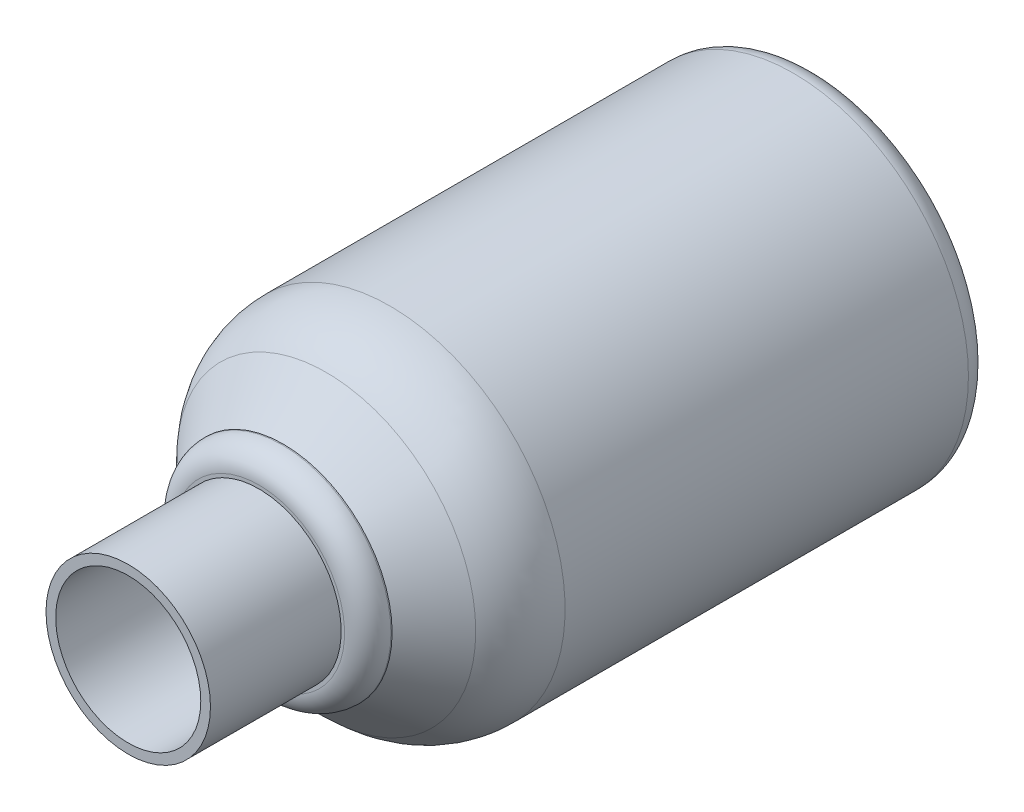
ISO-10303-21;
HEADER;
FILE_DESCRIPTION(('STEP AP214'),'2;1');
FILE_NAME('part.step','',(''),(''),'','','');
FILE_SCHEMA(('AUTOMOTIVE_DESIGN { 1 0 10303 214 1 1 1 1 }'));
ENDSEC;
DATA;
#1=APPLICATION_CONTEXT('core data for automotive mechanical design processes');
#2=APPLICATION_PROTOCOL_DEFINITION('international standard','automotive_design',2000,#1);
#3=PRODUCT_CONTEXT('',#1,'mechanical');
#4=PRODUCT('Part','Part','',(#3));
#5=PRODUCT_RELATED_PRODUCT_CATEGORY('part','',(#4));
#6=PRODUCT_DEFINITION_FORMATION('','',#4);
#7=PRODUCT_DEFINITION_CONTEXT('part definition',#1,'design');
#8=PRODUCT_DEFINITION('design','',#6,#7);
#9=PRODUCT_DEFINITION_SHAPE('','',#8);
#10=(LENGTH_UNIT() NAMED_UNIT(*) SI_UNIT(.MILLI.,.METRE.));
#11=(NAMED_UNIT(*) PLANE_ANGLE_UNIT() SI_UNIT($,.RADIAN.));
#12=(NAMED_UNIT(*) SI_UNIT($,.STERADIAN.) SOLID_ANGLE_UNIT());
#13=UNCERTAINTY_MEASURE_WITH_UNIT(LENGTH_MEASURE(1.E-05),#10,'distance_accuracy_value','');
#14=(GEOMETRIC_REPRESENTATION_CONTEXT(3) GLOBAL_UNCERTAINTY_ASSIGNED_CONTEXT((#13)) GLOBAL_UNIT_ASSIGNED_CONTEXT((#10,
#11,#12)) REPRESENTATION_CONTEXT('',''));
#15=CARTESIAN_POINT('',(0.,0.,0.));
#16=DIRECTION('',(0.,0.,1.));
#17=DIRECTION('',(1.,0.,0.));
#18=AXIS2_PLACEMENT_3D('',#15,#16,#17);
#19=CARTESIAN_POINT('',(0.,0.,14.63));
#20=DIRECTION('',(0.,0.,-1.));
#21=DIRECTION('',(-1.,0.,0.));
#22=AXIS2_PLACEMENT_3D('',#19,#20,#21);
#23=CYLINDRICAL_SURFACE('',#22,8.87);
#24=CARTESIAN_POINT('',(0.,0.,14.63));
#25=DIRECTION('',(0.,0.,1.));
#26=DIRECTION('',(1.,0.,0.));
#27=AXIS2_PLACEMENT_3D('',#24,#25,#26);
#28=CIRCLE('',#27,8.87);
#29=CARTESIAN_POINT('',(8.87,0.,14.63));
#30=VERTEX_POINT('',#29);
#31=EDGE_CURVE('E131',#30,#30,#28,.T.);
#32=ORIENTED_EDGE('',*,*,#31,.F.);
#33=EDGE_LOOP('',(#32));
#34=FACE_BOUND('',#33,.T.);
#35=CARTESIAN_POINT('',(0.,0.,0.529999999999999));
#36=DIRECTION('',(0.,0.,-1.));
#37=DIRECTION('',(-1.,0.,0.));
#38=AXIS2_PLACEMENT_3D('',#35,#36,#37);
#39=CIRCLE('',#38,8.87);
#40=CARTESIAN_POINT('',(-8.87,0.,0.529999999999999));
#41=VERTEX_POINT('',#40);
#42=EDGE_CURVE('E81',#41,#41,#39,.T.);
#43=ORIENTED_EDGE('',*,*,#42,.F.);
#44=EDGE_LOOP('',(#43));
#45=FACE_BOUND('',#44,.T.);
#46=ADVANCED_FACE('F44',(#34,#45),#23,.T.);
#47=CARTESIAN_POINT('',(0.,0.,14.63));
#48=DIRECTION('',(0.,0.,-1.));
#49=DIRECTION('',(-1.,0.,0.));
#50=AXIS2_PLACEMENT_3D('',#47,#48,#49);
#51=CYLINDRICAL_SURFACE('',#50,7.825);
#52=CARTESIAN_POINT('',(0.,0.,14.63));
#53=DIRECTION('',(0.,0.,1.));
#54=DIRECTION('',(1.,0.,0.));
#55=AXIS2_PLACEMENT_3D('',#52,#53,#54);
#56=CIRCLE('',#55,7.825);
#57=CARTESIAN_POINT('',(7.825,0.,14.63));
#58=VERTEX_POINT('',#57);
#59=EDGE_CURVE('E68',#58,#58,#56,.T.);
#60=ORIENTED_EDGE('',*,*,#59,.T.);
#61=EDGE_LOOP('',(#60));
#62=FACE_BOUND('',#61,.T.);
#63=CARTESIAN_POINT('',(0.,0.,0.));
#64=DIRECTION('',(0.,0.,1.));
#65=DIRECTION('',(1.,0.,0.));
#66=AXIS2_PLACEMENT_3D('',#63,#64,#65);
#67=CIRCLE('',#66,7.825);
#68=CARTESIAN_POINT('',(7.825,0.,0.));
#69=VERTEX_POINT('',#68);
#70=EDGE_CURVE('E69',#69,#69,#67,.T.);
#71=ORIENTED_EDGE('',*,*,#70,.F.);
#72=EDGE_LOOP('',(#71));
#73=FACE_BOUND('',#72,.T.);
#74=ADVANCED_FACE('F105',(#62,#73),#51,.F.);
#75=CARTESIAN_POINT('',(0.,0.,14.63));
#76=DIRECTION('',(0.,0.,1.));
#77=DIRECTION('',(1.,0.,0.));
#78=AXIS2_PLACEMENT_3D('',#75,#76,#77);
#79=PLANE('',#78);
#80=ORIENTED_EDGE('',*,*,#31,.T.);
#81=EDGE_LOOP('',(#80));
#82=FACE_BOUND('',#81,.T.);
#83=ORIENTED_EDGE('',*,*,#59,.F.);
#84=EDGE_LOOP('',(#83));
#85=FACE_BOUND('',#84,.T.);
#86=ADVANCED_FACE('F101',(#82,#85),#79,.T.);
#87=CARTESIAN_POINT('',(0.,0.,0.529999999999998));
#88=DIRECTION('',(0.,0.,-1.));
#89=DIRECTION('',(-1.,0.,0.));
#90=AXIS2_PLACEMENT_3D('',#87,#88,#89);
#91=PLANE('',#90);
#92=CARTESIAN_POINT('',(0.,0.,0.529999999999998));
#93=DIRECTION('',(0.,0.,-1.));
#94=DIRECTION('',(-1.,0.,0.));
#95=AXIS2_PLACEMENT_3D('',#92,#93,#94);
#96=CIRCLE('',#95,9.235);
#97=CARTESIAN_POINT('',(-9.235,0.,0.529999999999998));
#98=VERTEX_POINT('',#97);
#99=EDGE_CURVE('E75',#98,#98,#96,.F.);
#100=ORIENTED_EDGE('',*,*,#99,.T.);
#101=EDGE_LOOP('',(#100));
#102=FACE_BOUND('',#101,.T.);
#103=ORIENTED_EDGE('',*,*,#42,.T.);
#104=EDGE_LOOP('',(#103));
#105=FACE_BOUND('',#104,.T.);
#106=ADVANCED_FACE('F146',(#102,#105),#91,.F.);
#107=CARTESIAN_POINT('',(0.,0.,0.529999999999998));
#108=DIRECTION('',(0.,0.,-1.));
#109=DIRECTION('',(-1.,0.,0.));
#110=AXIS2_PLACEMENT_3D('',#107,#108,#109);
#111=CYLINDRICAL_SURFACE('',#110,11.735);
#112=CARTESIAN_POINT('',(0.,0.,-1.97));
#113=DIRECTION('',(0.,0.,-1.));
#114=DIRECTION('',(-1.,0.,0.));
#115=AXIS2_PLACEMENT_3D('',#112,#113,#114);
#116=CIRCLE('',#115,11.735);
#117=CARTESIAN_POINT('',(-11.735,0.,-1.97));
#118=VERTEX_POINT('',#117);
#119=EDGE_CURVE('E78',#118,#118,#116,.T.);
#120=ORIENTED_EDGE('',*,*,#119,.T.);
#121=EDGE_LOOP('',(#120));
#122=FACE_BOUND('',#121,.T.);
#123=CARTESIAN_POINT('',(0.,0.,-2.1));
#124=DIRECTION('',(0.,0.,-1.));
#125=DIRECTION('',(-1.,0.,0.));
#126=AXIS2_PLACEMENT_3D('',#123,#124,#125);
#127=CIRCLE('',#126,11.735);
#128=CARTESIAN_POINT('',(-11.735,0.,-2.1));
#129=VERTEX_POINT('',#128);
#130=EDGE_CURVE('E65',#129,#129,#127,.T.);
#131=ORIENTED_EDGE('',*,*,#130,.F.);
#132=EDGE_LOOP('',(#131));
#133=FACE_BOUND('',#132,.T.);
#134=ADVANCED_FACE('F166',(#122,#133),#111,.T.);
#135=CARTESIAN_POINT('',(0.,0.,0.529999999999998));
#136=DIRECTION('',(0.,0.,-1.));
#137=DIRECTION('',(-1.,0.,0.));
#138=AXIS2_PLACEMENT_3D('',#135,#136,#137);
#139=CYLINDRICAL_SURFACE('',#138,10.685);
#140=CARTESIAN_POINT('',(0.,0.,-0.866199058773649));
#141=DIRECTION('',(0.,0.,-1.));
#142=DIRECTION('',(-1.,0.,0.));
#143=AXIS2_PLACEMENT_3D('',#140,#141,#142);
#144=CIRCLE('',#143,10.685);
#145=CARTESIAN_POINT('',(-10.685,0.,-0.866199058773649));
#146=VERTEX_POINT('',#145);
#147=EDGE_CURVE('E56',#146,#146,#144,.F.);
#148=ORIENTED_EDGE('',*,*,#147,.T.);
#149=EDGE_LOOP('',(#148));
#150=FACE_BOUND('',#149,.T.);
#151=CARTESIAN_POINT('',(0.,0.,-2.1));
#152=DIRECTION('',(0.,0.,-1.));
#153=DIRECTION('',(-1.,0.,0.));
#154=AXIS2_PLACEMENT_3D('',#151,#152,#153);
#155=CIRCLE('',#154,10.685);
#156=CARTESIAN_POINT('',(-10.685,0.,-2.1));
#157=VERTEX_POINT('',#156);
#158=EDGE_CURVE('E71',#157,#157,#155,.T.);
#159=ORIENTED_EDGE('',*,*,#158,.T.);
#160=EDGE_LOOP('',(#159));
#161=FACE_BOUND('',#160,.T.);
#162=ADVANCED_FACE('F99',(#150,#161),#139,.F.);
#163=CARTESIAN_POINT('',(0.,0.,0.));
#164=DIRECTION('',(0.,0.,1.));
#165=DIRECTION('',(1.,0.,0.));
#166=AXIS2_PLACEMENT_3D('',#163,#164,#165);
#167=PLANE('',#166);
#168=ORIENTED_EDGE('',*,*,#70,.T.);
#169=EDGE_LOOP('',(#168));
#170=FACE_BOUND('',#169,.T.);
#171=CARTESIAN_POINT('',(0.,0.,0.));
#172=DIRECTION('',(0.,0.,1.));
#173=DIRECTION('',(1.,0.,0.));
#174=AXIS2_PLACEMENT_3D('',#171,#172,#173);
#175=CIRCLE('',#174,8.87);
#176=CARTESIAN_POINT('',(8.87,0.,0.));
#177=VERTEX_POINT('',#176);
#178=EDGE_CURVE('E128',#177,#177,#175,.T.);
#179=ORIENTED_EDGE('',*,*,#178,.F.);
#180=EDGE_LOOP('',(#179));
#181=FACE_BOUND('',#180,.T.);
#182=ADVANCED_FACE('F88',(#170,#181),#167,.F.);
#183=CARTESIAN_POINT('',(0.,0.,0.));
#184=DIRECTION('',(0.,0.,1.));
#185=DIRECTION('',(1.,0.,0.));
#186=AXIS2_PLACEMENT_3D('',#183,#184,#185);
#187=CONICAL_SURFACE('',#186,8.87,1.3878729978122);
#188=CARTESIAN_POINT('',(0.,0.,0.117117068530678));
#189=DIRECTION('',(0.,0.,-1.));
#190=DIRECTION('',(-1.,0.,0.));
#191=AXIS2_PLACEMENT_3D('',#188,#189,#190);
#192=CIRCLE('',#191,9.50309509686866);
#193=CARTESIAN_POINT('',(-9.50309509686866,0.,0.117117068530678));
#194=VERTEX_POINT('',#193);
#195=EDGE_CURVE('E60',#194,#194,#192,.T.);
#196=ORIENTED_EDGE('',*,*,#195,.T.);
#197=EDGE_LOOP('',(#196));
#198=FACE_BOUND('',#197,.T.);
#199=ORIENTED_EDGE('',*,*,#178,.T.);
#200=EDGE_LOOP('',(#199));
#201=FACE_BOUND('',#200,.T.);
#202=ADVANCED_FACE('F98',(#198,#201),#187,.T.);
#203=CARTESIAN_POINT('',(0.,0.,-1.97));
#204=DIRECTION('',(0.,0.,-1.));
#205=DIRECTION('',(-1.,0.,0.));
#206=AXIS2_PLACEMENT_3D('',#203,#204,#205);
#207=TOROIDAL_SURFACE('',#206,9.235,2.5);
#208=ORIENTED_EDGE('',*,*,#99,.F.);
#209=EDGE_LOOP('',(#208));
#210=FACE_BOUND('',#209,.T.);
#211=ORIENTED_EDGE('',*,*,#119,.F.);
#212=EDGE_LOOP('',(#211));
#213=FACE_BOUND('',#212,.T.);
#214=ADVANCED_FACE('F107',(#210,#213),#207,.T.);
#215=CARTESIAN_POINT('',(0.,0.,-0.866199058773649));
#216=DIRECTION('',(0.,0.,-1.));
#217=DIRECTION('',(-1.,0.,0.));
#218=AXIS2_PLACEMENT_3D('',#215,#216,#217);
#219=TOROIDAL_SURFACE('',#218,9.685,1.);
#220=ORIENTED_EDGE('',*,*,#147,.F.);
#221=EDGE_LOOP('',(#220));
#222=FACE_BOUND('',#221,.T.);
#223=ORIENTED_EDGE('',*,*,#195,.F.);
#224=EDGE_LOOP('',(#223));
#225=FACE_BOUND('',#224,.T.);
#226=ADVANCED_FACE('F109',(#222,#225),#219,.F.);
#227=CARTESIAN_POINT('',(0.,0.,-2.1));
#228=DIRECTION('',(0.,0.,-1.));
#229=DIRECTION('',(-1.,0.,0.));
#230=AXIS2_PLACEMENT_3D('',#227,#228,#229);
#231=PLANE('',#230);
#232=ORIENTED_EDGE('',*,*,#158,.F.);
#233=EDGE_LOOP('',(#232));
#234=FACE_BOUND('',#233,.T.);
#235=ADVANCED_FACE('F112',(#234),#231,.F.);
#236=CARTESIAN_POINT('',(0.,0.,-2.1));
#237=DIRECTION('',(0.,0.,-1.));
#238=DIRECTION('',(-1.,0.,0.));
#239=AXIS2_PLACEMENT_3D('',#236,#237,#238);
#240=CONICAL_SURFACE('',#239,11.735,0.759832647066953);
#241=CARTESIAN_POINT('',(0.,0.,-6.72515567247279));
#242=DIRECTION('',(0.,0.,-1.));
#243=DIRECTION('',(-1.,0.,0.));
#244=AXIS2_PLACEMENT_3D('',#241,#242,#243);
#245=CIRCLE('',#244,16.129512936146);
#246=CARTESIAN_POINT('',(-16.129512936146,0.,-6.72515567247279));
#247=VERTEX_POINT('',#246);
#248=EDGE_CURVE('E52',#247,#247,#245,.F.);
#249=ORIENTED_EDGE('',*,*,#248,.T.);
#250=EDGE_LOOP('',(#249));
#251=FACE_BOUND('',#250,.T.);
#252=ORIENTED_EDGE('',*,*,#130,.T.);
#253=EDGE_LOOP('',(#252));
#254=FACE_BOUND('',#253,.T.);
#255=ADVANCED_FACE('F117',(#251,#254),#240,.T.);
#256=CARTESIAN_POINT('',(0.,0.,-57.12));
#257=DIRECTION('',(0.,0.,1.));
#258=DIRECTION('',(1.,0.,0.));
#259=AXIS2_PLACEMENT_3D('',#256,#257,#258);
#260=TOROIDAL_SURFACE('',#259,16.38,2.5);
#261=CARTESIAN_POINT('',(0.,0.,-59.62));
#262=DIRECTION('',(0.,0.,1.));
#263=DIRECTION('',(1.,0.,0.));
#264=AXIS2_PLACEMENT_3D('',#261,#262,#263);
#265=CIRCLE('',#264,16.38);
#266=CARTESIAN_POINT('',(16.38,0.,-59.62));
#267=VERTEX_POINT('',#266);
#268=EDGE_CURVE('E197',#267,#267,#265,.F.);
#269=ORIENTED_EDGE('',*,*,#268,.F.);
#270=EDGE_LOOP('',(#269));
#271=FACE_BOUND('',#270,.T.);
#272=CARTESIAN_POINT('',(0.,0.,-57.12));
#273=DIRECTION('',(0.,0.,1.));
#274=DIRECTION('',(1.,0.,0.));
#275=AXIS2_PLACEMENT_3D('',#272,#273,#274);
#276=CIRCLE('',#275,18.88);
#277=CARTESIAN_POINT('',(18.88,0.,-57.12));
#278=VERTEX_POINT('',#277);
#279=EDGE_CURVE('E199',#278,#278,#276,.T.);
#280=ORIENTED_EDGE('',*,*,#279,.F.);
#281=EDGE_LOOP('',(#280));
#282=FACE_BOUND('',#281,.T.);
#283=ADVANCED_FACE('F179',(#271,#282),#260,.T.);
#284=CARTESIAN_POINT('',(0.,0.,-59.62));
#285=DIRECTION('',(0.,0.,1.));
#286=DIRECTION('',(1.,0.,0.));
#287=AXIS2_PLACEMENT_3D('',#284,#285,#286);
#288=PLANE('',#287);
#289=ORIENTED_EDGE('',*,*,#268,.T.);
#290=EDGE_LOOP('',(#289));
#291=FACE_BOUND('',#290,.T.);
#292=ADVANCED_FACE('F184',(#291),#288,.F.);
#293=CARTESIAN_POINT('',(0.,0.,-58.62));
#294=DIRECTION('',(0.,0.,-1.));
#295=DIRECTION('',(-1.,0.,0.));
#296=AXIS2_PLACEMENT_3D('',#293,#294,#295);
#297=CYLINDRICAL_SURFACE('',#296,18.88);
#298=CARTESIAN_POINT('',(0.,0.,-13.6131569927871));
#299=DIRECTION('',(0.,0.,-1.));
#300=DIRECTION('',(-1.,0.,0.));
#301=AXIS2_PLACEMENT_3D('',#298,#299,#300);
#302=CIRCLE('',#301,18.88);
#303=CARTESIAN_POINT('',(-18.88,0.,-13.6131569927871));
#304=VERTEX_POINT('',#303);
#305=EDGE_CURVE('E11',#304,#304,#302,.T.);
#306=ORIENTED_EDGE('',*,*,#305,.T.);
#307=EDGE_LOOP('',(#306));
#308=FACE_BOUND('',#307,.T.);
#309=ORIENTED_EDGE('',*,*,#279,.T.);
#310=EDGE_LOOP('',(#309));
#311=FACE_BOUND('',#310,.T.);
#312=ADVANCED_FACE('F231',(#308,#311),#297,.T.);
#313=CARTESIAN_POINT('',(0.,0.,-13.6131569927871));
#314=DIRECTION('',(0.,0.,-1.));
#315=DIRECTION('',(-1.,0.,0.));
#316=AXIS2_PLACEMENT_3D('',#313,#314,#315);
#317=DEGENERATE_TOROIDAL_SURFACE('',#316,8.88,10.,.T.);
#318=ORIENTED_EDGE('',*,*,#305,.F.);
#319=EDGE_LOOP('',(#318));
#320=FACE_BOUND('',#319,.T.);
#321=ORIENTED_EDGE('',*,*,#248,.F.);
#322=EDGE_LOOP('',(#321));
#323=FACE_BOUND('',#322,.T.);
#324=ADVANCED_FACE('F46',(#320,#323),#317,.T.);
#325=CLOSED_SHELL('',(#46,#74,#86,#106,#134,#162,#182,#202,#214,#226,#235,#255,#283,#292,#312,#324));
#326=CARTESIAN_POINT('',(0.,0.,-9.61999999999999));
#327=DIRECTION('',(0.,0.,1.));
#328=DIRECTION('',(1.,0.,0.));
#329=AXIS2_PLACEMENT_3D('',#326,#327,#328);
#330=PLANE('',#329);
#331=CARTESIAN_POINT('',(0.,0.,-9.61999999999999));
#332=DIRECTION('',(0.,0.,1.));
#333=DIRECTION('',(1.,0.,0.));
#334=AXIS2_PLACEMENT_3D('',#331,#332,#333);
#335=CIRCLE('',#334,17.83);
#336=CARTESIAN_POINT('',(17.83,0.,-9.61999999999999));
#337=VERTEX_POINT('',#336);
#338=EDGE_CURVE('E208',#337,#337,#335,.T.);
#339=ORIENTED_EDGE('',*,*,#338,.F.);
#340=EDGE_LOOP('',(#339));
#341=FACE_BOUND('',#340,.T.);
#342=ADVANCED_FACE('F188',(#341),#330,.F.);
#343=CARTESIAN_POINT('',(0.,0.,-9.61999999999999));
#344=DIRECTION('',(0.,0.,-1.));
#345=DIRECTION('',(-1.,0.,0.));
#346=AXIS2_PLACEMENT_3D('',#343,#344,#345);
#347=CYLINDRICAL_SURFACE('',#346,17.83);
#348=ORIENTED_EDGE('',*,*,#338,.T.);
#349=EDGE_LOOP('',(#348));
#350=FACE_BOUND('',#349,.T.);
#351=CARTESIAN_POINT('',(0.,0.,-58.62));
#352=DIRECTION('',(0.,0.,1.));
#353=DIRECTION('',(1.,0.,0.));
#354=AXIS2_PLACEMENT_3D('',#351,#352,#353);
#355=CIRCLE('',#354,17.83);
#356=CARTESIAN_POINT('',(17.83,0.,-58.62));
#357=VERTEX_POINT('',#356);
#358=EDGE_CURVE('E203',#357,#357,#355,.F.);
#359=ORIENTED_EDGE('',*,*,#358,.T.);
#360=EDGE_LOOP('',(#359));
#361=FACE_BOUND('',#360,.T.);
#362=ADVANCED_FACE('F212',(#350,#361),#347,.F.);
#363=CARTESIAN_POINT('',(0.,0.,-58.62));
#364=DIRECTION('',(0.,0.,1.));
#365=DIRECTION('',(1.,0.,0.));
#366=AXIS2_PLACEMENT_3D('',#363,#364,#365);
#367=PLANE('',#366);
#368=ORIENTED_EDGE('',*,*,#358,.F.);
#369=EDGE_LOOP('',(#368));
#370=FACE_BOUND('',#369,.T.);
#371=ADVANCED_FACE('F221',(#370),#367,.T.);
#372=CLOSED_SHELL('',(#342,#362,#371));
#373=ORIENTED_CLOSED_SHELL('',*,#372,.T.);
#374=BREP_WITH_VOIDS('B2',#325,(#373));
#375=ADVANCED_BREP_SHAPE_REPRESENTATION('',(#18,#374),#14);
#376=SHAPE_DEFINITION_REPRESENTATION(#9,#375);
ENDSEC;
END-ISO-10303-21;
